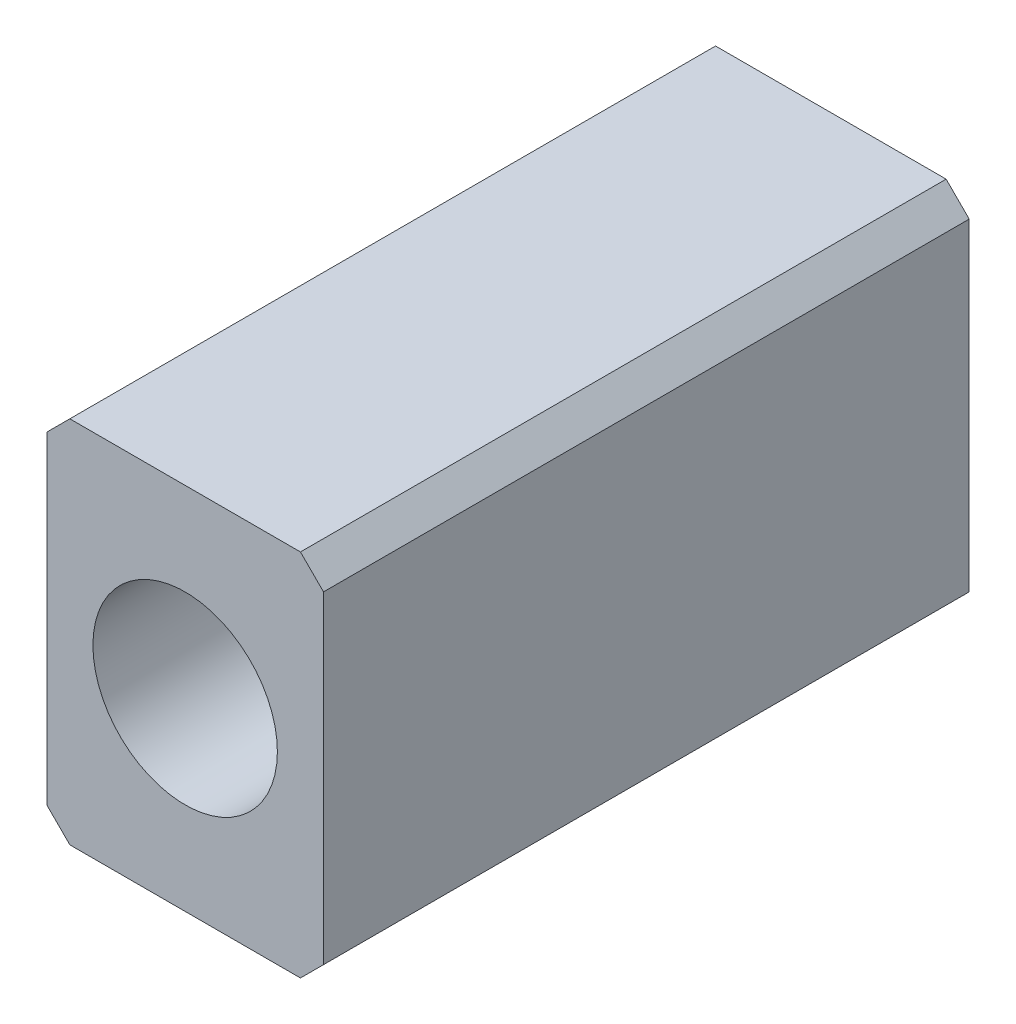
ISO-10303-21;
HEADER;
FILE_DESCRIPTION(('STEP AP214'),'2;1');
FILE_NAME('part.step','',(''),(''),'','','');
FILE_SCHEMA(('AUTOMOTIVE_DESIGN { 1 0 10303 214 1 1 1 1 }'));
ENDSEC;
DATA;
#1=APPLICATION_CONTEXT('core data for automotive mechanical design processes');
#2=APPLICATION_PROTOCOL_DEFINITION('international standard','automotive_design',2000,#1);
#3=PRODUCT_CONTEXT('',#1,'mechanical');
#4=PRODUCT('Part','Part','',(#3));
#5=PRODUCT_RELATED_PRODUCT_CATEGORY('part','',(#4));
#6=PRODUCT_DEFINITION_FORMATION('','',#4);
#7=PRODUCT_DEFINITION_CONTEXT('part definition',#1,'design');
#8=PRODUCT_DEFINITION('design','',#6,#7);
#9=PRODUCT_DEFINITION_SHAPE('','',#8);
#10=(LENGTH_UNIT() NAMED_UNIT(*) SI_UNIT(.MILLI.,.METRE.));
#11=(NAMED_UNIT(*) PLANE_ANGLE_UNIT() SI_UNIT($,.RADIAN.));
#12=(NAMED_UNIT(*) SI_UNIT($,.STERADIAN.) SOLID_ANGLE_UNIT());
#13=UNCERTAINTY_MEASURE_WITH_UNIT(LENGTH_MEASURE(1.E-05),#10,'distance_accuracy_value','');
#14=(GEOMETRIC_REPRESENTATION_CONTEXT(3) GLOBAL_UNCERTAINTY_ASSIGNED_CONTEXT((#13)) GLOBAL_UNIT_ASSIGNED_CONTEXT((#10,
#11,#12)) REPRESENTATION_CONTEXT('',''));
#15=CARTESIAN_POINT('',(0.,0.,0.));
#16=DIRECTION('',(0.,0.,1.));
#17=DIRECTION('',(1.,0.,0.));
#18=AXIS2_PLACEMENT_3D('',#15,#16,#17);
#19=CARTESIAN_POINT('',(0.,0.,14.));
#20=DIRECTION('',(0.,0.,1.));
#21=DIRECTION('',(1.,0.,0.));
#22=AXIS2_PLACEMENT_3D('',#19,#20,#21);
#23=PLANE('',#22);
#24=DIRECTION('',(0.,-1.,0.));
#25=VECTOR('',#24,1.);
#26=CARTESIAN_POINT('',(-6.,7.99999999999999,14.));
#27=LINE('',#26,#25);
#28=CARTESIAN_POINT('',(-6.,6.99999999999999,14.));
#29=VERTEX_POINT('',#28);
#30=CARTESIAN_POINT('',(-6.,-6.99999999999999,14.));
#31=VERTEX_POINT('',#30);
#32=EDGE_CURVE('E146',#29,#31,#27,.T.);
#33=ORIENTED_EDGE('',*,*,#32,.T.);
#34=DIRECTION('',(-0.707106781186546,0.707106781186549,0.));
#35=VECTOR('',#34,1.);
#36=CARTESIAN_POINT('',(-6.50000000000001,-6.49999999999998,14.));
#37=LINE('',#36,#35);
#38=CARTESIAN_POINT('',(-4.99999999999999,-8.,14.));
#39=VERTEX_POINT('',#38);
#40=EDGE_CURVE('E161',#31,#39,#37,.F.);
#41=ORIENTED_EDGE('',*,*,#40,.T.);
#42=DIRECTION('',(1.,0.,0.));
#43=VECTOR('',#42,1.);
#44=CARTESIAN_POINT('',(-6.,-8.,14.));
#45=LINE('',#44,#43);
#46=CARTESIAN_POINT('',(4.99999999999999,-7.99999999999999,14.));
#47=VERTEX_POINT('',#46);
#48=EDGE_CURVE('E128',#39,#47,#45,.T.);
#49=ORIENTED_EDGE('',*,*,#48,.T.);
#50=DIRECTION('',(-0.707106781186549,-0.707106781186546,0.));
#51=VECTOR('',#50,1.);
#52=CARTESIAN_POINT('',(6.49999999999998,-6.50000000000001,14.));
#53=LINE('',#52,#51);
#54=CARTESIAN_POINT('',(6.00000000000001,-6.99999999999999,14.));
#55=VERTEX_POINT('',#54);
#56=EDGE_CURVE('E159',#47,#55,#53,.F.);
#57=ORIENTED_EDGE('',*,*,#56,.T.);
#58=DIRECTION('',(0.,1.,0.));
#59=VECTOR('',#58,1.);
#60=CARTESIAN_POINT('',(6.,8.,14.));
#61=LINE('',#60,#59);
#62=CARTESIAN_POINT('',(6.,6.99999999999999,14.));
#63=VERTEX_POINT('',#62);
#64=EDGE_CURVE('E230',#55,#63,#61,.T.);
#65=ORIENTED_EDGE('',*,*,#64,.T.);
#66=DIRECTION('',(0.707106781186546,-0.707106781186549,0.));
#67=VECTOR('',#66,1.);
#68=CARTESIAN_POINT('',(6.50000000000001,6.49999999999998,14.));
#69=LINE('',#68,#67);
#70=CARTESIAN_POINT('',(5.,8.,14.));
#71=VERTEX_POINT('',#70);
#72=EDGE_CURVE('E63',#63,#71,#69,.F.);
#73=ORIENTED_EDGE('',*,*,#72,.T.);
#74=DIRECTION('',(-1.,0.,0.));
#75=VECTOR('',#74,1.);
#76=CARTESIAN_POINT('',(-6.,7.99999999999999,14.));
#77=LINE('',#76,#75);
#78=CARTESIAN_POINT('',(-4.99999999999999,7.99999999999999,14.));
#79=VERTEX_POINT('',#78);
#80=EDGE_CURVE('E147',#71,#79,#77,.T.);
#81=ORIENTED_EDGE('',*,*,#80,.T.);
#82=DIRECTION('',(0.707106781186549,0.707106781186546,0.));
#83=VECTOR('',#82,1.);
#84=CARTESIAN_POINT('',(-6.49999999999999,6.50000000000001,14.));
#85=LINE('',#84,#83);
#86=EDGE_CURVE('E157',#79,#29,#85,.F.);
#87=ORIENTED_EDGE('',*,*,#86,.T.);
#88=EDGE_LOOP('',(#33,#41,#49,#57,#65,#73,#81,#87));
#89=FACE_BOUND('',#88,.T.);
#90=CARTESIAN_POINT('',(0.,0.,14.));
#91=DIRECTION('',(0.,0.,1.));
#92=DIRECTION('',(1.,0.,0.));
#93=AXIS2_PLACEMENT_3D('',#90,#91,#92);
#94=CIRCLE('',#93,4.);
#95=CARTESIAN_POINT('',(4.,0.,14.));
#96=VERTEX_POINT('',#95);
#97=EDGE_CURVE('E141',#96,#96,#94,.T.);
#98=ORIENTED_EDGE('',*,*,#97,.F.);
#99=EDGE_LOOP('',(#98));
#100=FACE_BOUND('',#99,.T.);
#101=ADVANCED_FACE('F36',(#89,#100),#23,.T.);
#102=CARTESIAN_POINT('',(0.,0.,-14.));
#103=DIRECTION('',(0.,0.,1.));
#104=DIRECTION('',(1.,0.,0.));
#105=AXIS2_PLACEMENT_3D('',#102,#103,#104);
#106=PLANE('',#105);
#107=DIRECTION('',(1.,0.,0.));
#108=VECTOR('',#107,1.);
#109=CARTESIAN_POINT('',(-6.,-8.,-14.));
#110=LINE('',#109,#108);
#111=CARTESIAN_POINT('',(-4.99999999999999,-8.,-14.));
#112=VERTEX_POINT('',#111);
#113=CARTESIAN_POINT('',(5.,-7.99999999999999,-14.));
#114=VERTEX_POINT('',#113);
#115=EDGE_CURVE('E125',#112,#114,#110,.T.);
#116=ORIENTED_EDGE('',*,*,#115,.F.);
#117=DIRECTION('',(0.707106781186546,-0.707106781186549,0.));
#118=VECTOR('',#117,1.);
#119=CARTESIAN_POINT('',(-4.99999999999999,-8.,-14.));
#120=LINE('',#119,#118);
#121=CARTESIAN_POINT('',(-6.,-6.99999999999999,-14.));
#122=VERTEX_POINT('',#121);
#123=EDGE_CURVE('E108',#112,#122,#120,.F.);
#124=ORIENTED_EDGE('',*,*,#123,.T.);
#125=DIRECTION('',(0.,-1.,0.));
#126=VECTOR('',#125,1.);
#127=CARTESIAN_POINT('',(-6.,7.99999999999999,-14.));
#128=LINE('',#127,#126);
#129=CARTESIAN_POINT('',(-6.,6.99999999999999,-14.));
#130=VERTEX_POINT('',#129);
#131=EDGE_CURVE('E136',#130,#122,#128,.T.);
#132=ORIENTED_EDGE('',*,*,#131,.F.);
#133=DIRECTION('',(-0.707106781186549,-0.707106781186546,0.));
#134=VECTOR('',#133,1.);
#135=CARTESIAN_POINT('',(-6.,6.99999999999999,-14.));
#136=LINE('',#135,#134);
#137=CARTESIAN_POINT('',(-5.,7.99999999999999,-14.));
#138=VERTEX_POINT('',#137);
#139=EDGE_CURVE('E150',#130,#138,#136,.F.);
#140=ORIENTED_EDGE('',*,*,#139,.T.);
#141=DIRECTION('',(-1.,0.,0.));
#142=VECTOR('',#141,1.);
#143=CARTESIAN_POINT('',(-6.,7.99999999999999,-14.));
#144=LINE('',#143,#142);
#145=CARTESIAN_POINT('',(4.99999999999999,8.,-14.));
#146=VERTEX_POINT('',#145);
#147=EDGE_CURVE('E139',#146,#138,#144,.T.);
#148=ORIENTED_EDGE('',*,*,#147,.F.);
#149=DIRECTION('',(-0.707106781186546,0.707106781186549,0.));
#150=VECTOR('',#149,1.);
#151=CARTESIAN_POINT('',(5.,8.,-14.));
#152=LINE('',#151,#150);
#153=CARTESIAN_POINT('',(6.,6.99999999999999,-14.));
#154=VERTEX_POINT('',#153);
#155=EDGE_CURVE('E129',#146,#154,#152,.F.);
#156=ORIENTED_EDGE('',*,*,#155,.T.);
#157=DIRECTION('',(0.,1.,0.));
#158=VECTOR('',#157,1.);
#159=CARTESIAN_POINT('',(6.,8.,-14.));
#160=LINE('',#159,#158);
#161=CARTESIAN_POINT('',(6.00000000000001,-6.99999999999999,-14.));
#162=VERTEX_POINT('',#161);
#163=EDGE_CURVE('E135',#162,#154,#160,.T.);
#164=ORIENTED_EDGE('',*,*,#163,.F.);
#165=DIRECTION('',(0.707106781186549,0.707106781186546,0.));
#166=VECTOR('',#165,1.);
#167=CARTESIAN_POINT('',(6.00000000000001,-6.99999999999999,-14.));
#168=LINE('',#167,#166);
#169=EDGE_CURVE('E119',#162,#114,#168,.F.);
#170=ORIENTED_EDGE('',*,*,#169,.T.);
#171=EDGE_LOOP('',(#116,#124,#132,#140,#148,#156,#164,#170));
#172=FACE_BOUND('',#171,.T.);
#173=CARTESIAN_POINT('',(0.,0.,-14.));
#174=DIRECTION('',(0.,0.,1.));
#175=DIRECTION('',(1.,0.,0.));
#176=AXIS2_PLACEMENT_3D('',#173,#174,#175);
#177=CIRCLE('',#176,4.);
#178=CARTESIAN_POINT('',(4.,0.,-14.));
#179=VERTEX_POINT('',#178);
#180=EDGE_CURVE('E175',#179,#179,#177,.T.);
#181=ORIENTED_EDGE('',*,*,#180,.T.);
#182=EDGE_LOOP('',(#181));
#183=FACE_BOUND('',#182,.T.);
#184=ADVANCED_FACE('F132',(#172,#183),#106,.F.);
#185=CARTESIAN_POINT('',(-6.,7.99999999999999,14.));
#186=DIRECTION('',(1.,0.,0.));
#187=DIRECTION('',(0.,1.,0.));
#188=AXIS2_PLACEMENT_3D('',#185,#186,#187);
#189=PLANE('',#188);
#190=ORIENTED_EDGE('',*,*,#131,.T.);
#191=DIRECTION('',(0.,0.,1.));
#192=VECTOR('',#191,1.);
#193=CARTESIAN_POINT('',(-6.,-6.99999999999999,14.));
#194=LINE('',#193,#192);
#195=EDGE_CURVE('E113',#122,#31,#194,.T.);
#196=ORIENTED_EDGE('',*,*,#195,.T.);
#197=ORIENTED_EDGE('',*,*,#32,.F.);
#198=DIRECTION('',(0.,0.,-1.));
#199=VECTOR('',#198,1.);
#200=CARTESIAN_POINT('',(-6.,6.99999999999999,14.));
#201=LINE('',#200,#199);
#202=EDGE_CURVE('E118',#29,#130,#201,.T.);
#203=ORIENTED_EDGE('',*,*,#202,.T.);
#204=EDGE_LOOP('',(#190,#196,#197,#203));
#205=FACE_BOUND('',#204,.T.);
#206=ADVANCED_FACE('F196',(#205),#189,.F.);
#207=CARTESIAN_POINT('',(-6.,-8.,14.));
#208=DIRECTION('',(0.,1.,0.));
#209=DIRECTION('',(-1.,0.,0.));
#210=AXIS2_PLACEMENT_3D('',#207,#208,#209);
#211=PLANE('',#210);
#212=CARTESIAN_POINT('',(0.,-8.,-8.));
#213=DIRECTION('',(0.,-1.,0.));
#214=DIRECTION('',(0.,0.,-1.));
#215=AXIS2_PLACEMENT_3D('',#212,#213,#214);
#216=CIRCLE('',#215,1.24999999999999);
#217=CARTESIAN_POINT('',(0.,-8.,-9.24999999999999));
#218=VERTEX_POINT('',#217);
#219=EDGE_CURVE('E246',#218,#218,#216,.T.);
#220=ORIENTED_EDGE('',*,*,#219,.F.);
#221=EDGE_LOOP('',(#220));
#222=FACE_BOUND('',#221,.T.);
#223=CARTESIAN_POINT('',(0.,-8.,8.));
#224=DIRECTION('',(0.,-1.,0.));
#225=DIRECTION('',(0.,0.,-1.));
#226=AXIS2_PLACEMENT_3D('',#223,#224,#225);
#227=CIRCLE('',#226,1.24999999999999);
#228=CARTESIAN_POINT('',(0.,-8.,6.75000000000001));
#229=VERTEX_POINT('',#228);
#230=EDGE_CURVE('E176',#229,#229,#227,.T.);
#231=ORIENTED_EDGE('',*,*,#230,.F.);
#232=EDGE_LOOP('',(#231));
#233=FACE_BOUND('',#232,.T.);
#234=ORIENTED_EDGE('',*,*,#48,.F.);
#235=DIRECTION('',(0.,0.,-1.));
#236=VECTOR('',#235,1.);
#237=CARTESIAN_POINT('',(-4.99999999999999,-8.,14.));
#238=LINE('',#237,#236);
#239=EDGE_CURVE('E112',#39,#112,#238,.T.);
#240=ORIENTED_EDGE('',*,*,#239,.T.);
#241=ORIENTED_EDGE('',*,*,#115,.T.);
#242=DIRECTION('',(0.,0.,1.));
#243=VECTOR('',#242,1.);
#244=CARTESIAN_POINT('',(5.,-7.99999999999999,14.));
#245=LINE('',#244,#243);
#246=EDGE_CURVE('E130',#114,#47,#245,.T.);
#247=ORIENTED_EDGE('',*,*,#246,.T.);
#248=EDGE_LOOP('',(#234,#240,#241,#247));
#249=FACE_BOUND('',#248,.T.);
#250=ADVANCED_FACE('F124',(#222,#233,#249),#211,.F.);
#251=CARTESIAN_POINT('',(6.,8.,14.));
#252=DIRECTION('',(-1.,0.,0.));
#253=DIRECTION('',(0.,-1.,0.));
#254=AXIS2_PLACEMENT_3D('',#251,#252,#253);
#255=PLANE('',#254);
#256=ORIENTED_EDGE('',*,*,#64,.F.);
#257=DIRECTION('',(0.,0.,-1.));
#258=VECTOR('',#257,1.);
#259=CARTESIAN_POINT('',(6.00000000000001,-6.99999999999999,14.));
#260=LINE('',#259,#258);
#261=EDGE_CURVE('E165',#55,#162,#260,.T.);
#262=ORIENTED_EDGE('',*,*,#261,.T.);
#263=ORIENTED_EDGE('',*,*,#163,.T.);
#264=DIRECTION('',(0.,0.,1.));
#265=VECTOR('',#264,1.);
#266=CARTESIAN_POINT('',(6.,6.99999999999999,14.));
#267=LINE('',#266,#265);
#268=EDGE_CURVE('E163',#154,#63,#267,.T.);
#269=ORIENTED_EDGE('',*,*,#268,.T.);
#270=EDGE_LOOP('',(#256,#262,#263,#269));
#271=FACE_BOUND('',#270,.T.);
#272=ADVANCED_FACE('F204',(#271),#255,.F.);
#273=CARTESIAN_POINT('',(-6.,7.99999999999999,14.));
#274=DIRECTION('',(0.,-1.,0.));
#275=DIRECTION('',(1.,0.,0.));
#276=AXIS2_PLACEMENT_3D('',#273,#274,#275);
#277=PLANE('',#276);
#278=ORIENTED_EDGE('',*,*,#147,.T.);
#279=DIRECTION('',(0.,0.,1.));
#280=VECTOR('',#279,1.);
#281=CARTESIAN_POINT('',(-5.,7.99999999999999,14.));
#282=LINE('',#281,#280);
#283=EDGE_CURVE('E11',#138,#79,#282,.T.);
#284=ORIENTED_EDGE('',*,*,#283,.T.);
#285=ORIENTED_EDGE('',*,*,#80,.F.);
#286=DIRECTION('',(0.,0.,-1.));
#287=VECTOR('',#286,1.);
#288=CARTESIAN_POINT('',(5.,8.,14.));
#289=LINE('',#288,#287);
#290=EDGE_CURVE('E50',#71,#146,#289,.T.);
#291=ORIENTED_EDGE('',*,*,#290,.T.);
#292=EDGE_LOOP('',(#278,#284,#285,#291));
#293=FACE_BOUND('',#292,.T.);
#294=ADVANCED_FACE('F201',(#293),#277,.F.);
#295=CARTESIAN_POINT('',(0.,0.,14.));
#296=DIRECTION('',(0.,0.,-1.));
#297=DIRECTION('',(-1.,0.,0.));
#298=AXIS2_PLACEMENT_3D('',#295,#296,#297);
#299=CYLINDRICAL_SURFACE('',#298,4.);
#300=CARTESIAN_POINT('',(0.,-4.,-9.24999999999999));
#301=CARTESIAN_POINT('',(-0.0684391851745433,-3.99999965877989,-9.24999955341241));
#302=CARTESIAN_POINT('',(-0.136883052502855,-3.99822694984841,-9.24436077305553));
#303=CARTESIAN_POINT('',(-0.271769209588443,-3.99132894088807,-9.22201375846075));
#304=CARTESIAN_POINT('',(-0.338211042725901,-3.9862028819986,-9.20530301863563));
#305=CARTESIAN_POINT('',(-0.467128543650799,-3.97315815697909,-9.16143062880425));
#306=CARTESIAN_POINT('',(-0.529610176985796,-3.96524381499025,-9.13428515534702));
#307=CARTESIAN_POINT('',(-0.649134802346451,-3.94743969161093,-9.07038268232166));
#308=CARTESIAN_POINT('',(-0.706176935444876,-3.93754959899905,-9.0336241682194));
#309=CARTESIAN_POINT('',(-0.814965334952271,-3.91650213740283,-8.95034400798263));
#310=CARTESIAN_POINT('',(-0.866520028156649,-3.90531715926989,-8.90357911493892));
#311=CARTESIAN_POINT('',(-0.961197382036982,-3.88310046374209,-8.80213160758644));
#312=CARTESIAN_POINT('',(-1.00431847289868,-3.87206877523458,-8.74744752250545));
#313=CARTESIAN_POINT('',(-1.08194336483112,-3.85111144698173,-8.63005543619191));
#314=CARTESIAN_POINT('',(-1.11620784150128,-3.84121988301796,-8.56718252247277));
#315=CARTESIAN_POINT('',(-1.1735974107667,-3.82407801799235,-8.43620768501812));
#316=CARTESIAN_POINT('',(-1.19672543771943,-3.81682702128689,-8.36810714420606));
#317=CARTESIAN_POINT('',(-1.23048459930032,-3.80607606984501,-8.23077192254794));
#318=CARTESIAN_POINT('',(-1.24147110007863,-3.80246972929509,-8.16163315636114));
#319=CARTESIAN_POINT('',(-1.25174555036987,-3.79910055140951,-8.02240688108811));
#320=CARTESIAN_POINT('',(-1.2510366099577,-3.79933669227335,-7.95231962917834));
#321=CARTESIAN_POINT('',(-1.23821824732738,-3.80353189075438,-7.81612553973102));
#322=CARTESIAN_POINT('',(-1.22656057869381,-3.80734341745949,-7.74997087413844));
#323=CARTESIAN_POINT('',(-1.19290813355625,-3.81802025652489,-7.62060784346266));
#324=CARTESIAN_POINT('',(-1.17091225844549,-3.82488589343115,-7.5573997922912));
#325=CARTESIAN_POINT('',(-1.11688874681276,-3.84101044014297,-7.43464805556737));
#326=CARTESIAN_POINT('',(-1.0847192566208,-3.85030284660825,-7.37517138930802));
#327=CARTESIAN_POINT('',(-1.01136020737847,-3.8702185658007,-7.26231223212088));
#328=CARTESIAN_POINT('',(-0.97016830521576,-3.88084222394551,-7.20893132974629));
#329=CARTESIAN_POINT('',(-0.877716954182112,-3.90281527800493,-7.10722505658302));
#330=CARTESIAN_POINT('',(-0.826084570592806,-3.91417569605696,-7.05924044222032));
#331=CARTESIAN_POINT('',(-0.71536440809552,-3.9359157075958,-6.97252810642033));
#332=CARTESIAN_POINT('',(-0.656276077349011,-3.94629522838372,-6.9338010707808));
#333=CARTESIAN_POINT('',(-0.531664610465446,-3.96501294890191,-6.86647231139874));
#334=CARTESIAN_POINT('',(-0.466094906919271,-3.97333460648208,-6.83795186453604));
#335=CARTESIAN_POINT('',(-0.330767977782638,-3.98687955828554,-6.79244699914844));
#336=CARTESIAN_POINT('',(-0.261012030724602,-3.99210379325151,-6.77545907776162));
#337=CARTESIAN_POINT('',(-0.12218515729034,-3.99871389395014,-6.75408195742103));
#338=CARTESIAN_POINT('',(-0.0531918487888379,-4.00024022895439,-6.74923145640649));
#339=CARTESIAN_POINT('',(0.0846303057325878,-3.99969799730981,-6.75096622663734));
#340=CARTESIAN_POINT('',(0.153459174306508,-3.99762995581125,-6.75754982732262));
#341=CARTESIAN_POINT('',(0.287219332975853,-3.99022363769772,-6.78159559260641));
#342=CARTESIAN_POINT('',(0.352204978420948,-3.98496793110725,-6.79878326761253));
#343=CARTESIAN_POINT('',(0.478351928861364,-3.97180121379252,-6.8432143523667));
#344=CARTESIAN_POINT('',(0.539512760449015,-3.96388987514204,-6.87045900402492));
#345=CARTESIAN_POINT('',(0.65793240667223,-3.94598542759568,-6.93497321654881));
#346=CARTESIAN_POINT('',(0.715059739787952,-3.9359462681821,-6.97247098749723));
#347=CARTESIAN_POINT('',(0.822365850960092,-3.91493410002887,-7.05615321011703));
#348=CARTESIAN_POINT('',(0.872542738043332,-3.90396083845862,-7.10234001774312));
#349=CARTESIAN_POINT('',(0.966587462919651,-3.88176994885247,-7.2042588900537));
#350=CARTESIAN_POINT('',(1.01012652339773,-3.87055986714446,-7.26029666374527));
#351=CARTESIAN_POINT('',(1.08721250244908,-3.84961947087602,-7.37912661637075));
#352=CARTESIAN_POINT('',(1.12075957972523,-3.839889132814,-7.44191868800444));
#353=CARTESIAN_POINT('',(1.1767008348114,-3.82311782360754,-7.57234517288587));
#354=CARTESIAN_POINT('',(1.19913819558885,-3.81606646468027,-7.6399596495047));
#355=CARTESIAN_POINT('',(1.23222894320963,-3.80551170941212,-7.7782724933238));
#356=CARTESIAN_POINT('',(1.24288681414609,-3.80200696302675,-7.84896967637132));
#357=CARTESIAN_POINT('',(1.25179406157539,-3.79908292712495,-7.98800408755424));
#358=CARTESIAN_POINT('',(1.25058279621956,-3.79948604683077,-8.05630345381293));
#359=CARTESIAN_POINT('',(1.23708818129473,-3.80390090472383,-8.19167458491918));
#360=CARTESIAN_POINT('',(1.22480534822558,-3.80791247457319,-8.258746406884));
#361=CARTESIAN_POINT('',(1.18987729913377,-3.81896814158112,-8.38879403960178));
#362=CARTESIAN_POINT('',(1.16738642405943,-3.82596698183475,-8.45181544109601));
#363=CARTESIAN_POINT('',(1.11280227335063,-3.84219704261348,-8.57324041353135));
#364=CARTESIAN_POINT('',(1.08070704444253,-3.85142871716522,-8.63164304207768));
#365=CARTESIAN_POINT('',(1.00635675013474,-3.8715348703158,-8.74464597044056));
#366=CARTESIAN_POINT('',(0.963753335241266,-3.88245948922441,-8.79900812950044));
#367=CARTESIAN_POINT('',(0.870208996404841,-3.90448998821726,-8.89998632811179));
#368=CARTESIAN_POINT('',(0.819265842344396,-3.91559591606795,-8.946600288991));
#369=CARTESIAN_POINT('',(0.708486662823326,-3.93717271952329,-9.03228253836298));
#370=CARTESIAN_POINT('',(0.648414574487374,-3.94761101730634,-9.07105473644996));
#371=CARTESIAN_POINT('',(0.522279138013649,-3.96626769296917,-9.13789891513943));
#372=CARTESIAN_POINT('',(0.456218157795445,-3.97448694315832,-9.16597510214182));
#373=CARTESIAN_POINT('',(0.325747635373975,-3.98720650733461,-9.20859136760846));
#374=CARTESIAN_POINT('',(0.261670337112545,-3.99196240806139,-9.22407486730533));
#375=CARTESIAN_POINT('',(0.131729895440249,-3.99835900340486,-9.2447783599677));
#376=CARTESIAN_POINT('',(0.0658671161396766,-4.00000032839644,-9.25000042980399));
#377=CARTESIAN_POINT('',(0.,-4.,-9.24999999999999));
#378=B_SPLINE_CURVE_WITH_KNOTS('',3,(#300,#301,#302,#303,#304,#305,#306,#307,#308,#309,#310,
#311,#312,#313,#314,#315,#316,#317,#318,#319,#320,#321,#322,#323,#324,#325,#326,#327,#328,#329,
#330,#331,#332,#333,#334,#335,#336,#337,#338,#339,#340,#341,#342,#343,#344,#345,#346,#347,#348,
#349,#350,#351,#352,#353,#354,#355,#356,#357,#358,#359,#360,#361,#362,#363,#364,#365,#366,#367,
#368,#369,#370,#371,#372,#373,#374,#375,#376,#377),.UNSPECIFIED.,.T.,.F.,(4,2,2,2,2,2,2,2,2,2,2,
2,2,2,2,2,2,2,2,2,2,2,2,2,2,2,2,2,2,2,2,2,2,2,2,2,2,2,4),(0.,0.205075449432508,
0.410197323349063,0.61500247920243,0.819839921558384,1.03037822195157,1.24095567431275,
1.45673771247493,1.67246286279526,1.88169150167208,2.09086450295136,2.29176917422167,
2.49269519979061,2.69655642720543,2.90047066010356,3.11366747279597,3.326880074133,
3.54175460689767,3.7565638449455,3.96307568548234,4.16955735649359,4.37090626722868,
4.57228005034495,4.77856324738339,4.98490245709255,5.19941778713135,5.41392970983707,
5.62760115751026,5.84119123892425,6.04512203476048,6.24904331751079,6.44997913396665,
6.65095584330168,6.85979514006355,7.06869037373334,7.28440668126406,7.5000380666633,
7.69744636651534,7.8948147076304),.UNSPECIFIED.);
#379=CARTESIAN_POINT('',(0.,-4.,-9.24999999999999));
#380=VERTEX_POINT('',#379);
#381=EDGE_CURVE('E40',#380,#380,#378,.T.);
#382=ORIENTED_EDGE('',*,*,#381,.F.);
#383=EDGE_LOOP('',(#382));
#384=FACE_BOUND('',#383,.T.);
#385=CARTESIAN_POINT('',(0.,-4.,6.75000000000001));
#386=CARTESIAN_POINT('',(-0.0684391851745431,-3.99999965877989,6.75000044658759));
#387=CARTESIAN_POINT('',(-0.136883052502855,-3.99822694984841,6.75563922694447));
#388=CARTESIAN_POINT('',(-0.271769209588443,-3.99132894088807,6.77798624153925));
#389=CARTESIAN_POINT('',(-0.338211042725901,-3.9862028819986,6.79469698136437));
#390=CARTESIAN_POINT('',(-0.467128543650799,-3.97315815697909,6.83856937119575));
#391=CARTESIAN_POINT('',(-0.529610176985796,-3.96524381499025,6.86571484465298));
#392=CARTESIAN_POINT('',(-0.649134802346451,-3.94743969161093,6.92961731767834));
#393=CARTESIAN_POINT('',(-0.706176935444875,-3.93754959899905,6.9663758317806));
#394=CARTESIAN_POINT('',(-0.814965334952271,-3.91650213740283,7.04965599201737));
#395=CARTESIAN_POINT('',(-0.866520028156649,-3.90531715926989,7.09642088506108));
#396=CARTESIAN_POINT('',(-0.961197382036982,-3.88310046374209,7.19786839241356));
#397=CARTESIAN_POINT('',(-1.00431847289868,-3.87206877523458,7.25255247749455));
#398=CARTESIAN_POINT('',(-1.08194336483112,-3.85111144698173,7.36994456380809));
#399=CARTESIAN_POINT('',(-1.11620784150127,-3.84121988301796,7.43281747752723));
#400=CARTESIAN_POINT('',(-1.1735974107667,-3.82407801799235,7.56379231498188));
#401=CARTESIAN_POINT('',(-1.19672543771943,-3.81682702128689,7.63189285579393));
#402=CARTESIAN_POINT('',(-1.23048459930032,-3.80607606984501,7.76922807745206));
#403=CARTESIAN_POINT('',(-1.24147110007863,-3.80246972929509,7.83836684363885));
#404=CARTESIAN_POINT('',(-1.25174555036987,-3.79910055140951,7.97759311891189));
#405=CARTESIAN_POINT('',(-1.2510366099577,-3.79933669227335,8.04768037082166));
#406=CARTESIAN_POINT('',(-1.23821824732738,-3.80353189075438,8.18387446026898));
#407=CARTESIAN_POINT('',(-1.22656057869381,-3.80734341745949,8.25002912586156));
#408=CARTESIAN_POINT('',(-1.19290813355625,-3.81802025652489,8.37939215653734));
#409=CARTESIAN_POINT('',(-1.17091225844549,-3.82488589343115,8.4426002077088));
#410=CARTESIAN_POINT('',(-1.11688874681276,-3.84101044014297,8.56535194443263));
#411=CARTESIAN_POINT('',(-1.08471925662081,-3.85030284660825,8.62482861069198));
#412=CARTESIAN_POINT('',(-1.01136020737847,-3.8702185658007,8.73768776787912));
#413=CARTESIAN_POINT('',(-0.970168305215761,-3.88084222394551,8.79106867025371));
#414=CARTESIAN_POINT('',(-0.877716954182113,-3.90281527800493,8.89277494341698));
#415=CARTESIAN_POINT('',(-0.826084570592807,-3.91417569605696,8.94075955777967));
#416=CARTESIAN_POINT('',(-0.715364408095521,-3.9359157075958,9.02747189357967));
#417=CARTESIAN_POINT('',(-0.656276077349012,-3.94629522838372,9.0661989292192));
#418=CARTESIAN_POINT('',(-0.531664610465447,-3.96501294890191,9.13352768860127));
#419=CARTESIAN_POINT('',(-0.466094906919272,-3.97333460648208,9.16204813546396));
#420=CARTESIAN_POINT('',(-0.330767977782638,-3.98687955828554,9.20755300085156));
#421=CARTESIAN_POINT('',(-0.261012030724602,-3.99210379325151,9.22454092223838));
#422=CARTESIAN_POINT('',(-0.122185157290339,-3.99871389395014,9.24591804257897));
#423=CARTESIAN_POINT('',(-0.0531918487888372,-4.00024022895439,9.25076854359351));
#424=CARTESIAN_POINT('',(0.0846303057325882,-3.99969799730981,9.24903377336266));
#425=CARTESIAN_POINT('',(0.153459174306508,-3.99762995581125,9.24245017267738));
#426=CARTESIAN_POINT('',(0.287219332975853,-3.99022363769772,9.21840440739359));
#427=CARTESIAN_POINT('',(0.352204978420948,-3.98496793110725,9.20121673238747));
#428=CARTESIAN_POINT('',(0.478351928861365,-3.97180121379252,9.1567856476333));
#429=CARTESIAN_POINT('',(0.539512760449014,-3.96388987514204,9.12954099597508));
#430=CARTESIAN_POINT('',(0.657932406672229,-3.94598542759568,9.0650267834512));
#431=CARTESIAN_POINT('',(0.715059739787953,-3.9359462681821,9.02752901250277));
#432=CARTESIAN_POINT('',(0.822365850960092,-3.91493410002887,8.94384678988298));
#433=CARTESIAN_POINT('',(0.872542738043331,-3.90396083845862,8.89765998225688));
#434=CARTESIAN_POINT('',(0.966587462919651,-3.88176994885248,8.7957411099463));
#435=CARTESIAN_POINT('',(1.01012652339773,-3.87055986714446,8.73970333625473));
#436=CARTESIAN_POINT('',(1.08721250244908,-3.84961947087602,8.62087338362925));
#437=CARTESIAN_POINT('',(1.12075957972523,-3.839889132814,8.55808131199556));
#438=CARTESIAN_POINT('',(1.1767008348114,-3.82311782360754,8.42765482711414));
#439=CARTESIAN_POINT('',(1.19913819558885,-3.81606646468027,8.3600403504953));
#440=CARTESIAN_POINT('',(1.23222894320963,-3.80551170941212,8.2217275066762));
#441=CARTESIAN_POINT('',(1.24288681414609,-3.80200696302675,8.15103032362868));
#442=CARTESIAN_POINT('',(1.25179406157539,-3.79908292712495,8.01199591244576));
#443=CARTESIAN_POINT('',(1.25058279621956,-3.79948604683077,7.94369654618707));
#444=CARTESIAN_POINT('',(1.23708818129473,-3.80390090472383,7.80832541508082));
#445=CARTESIAN_POINT('',(1.22480534822558,-3.80791247457319,7.741253593116));
#446=CARTESIAN_POINT('',(1.18987729913377,-3.81896814158112,7.61120596039822));
#447=CARTESIAN_POINT('',(1.16738642405943,-3.82596698183475,7.54818455890399));
#448=CARTESIAN_POINT('',(1.11280227335063,-3.84219704261348,7.42675958646865));
#449=CARTESIAN_POINT('',(1.08070704444253,-3.85142871716522,7.36835695792232));
#450=CARTESIAN_POINT('',(1.00635675013474,-3.8715348703158,7.25535402955944));
#451=CARTESIAN_POINT('',(0.963753335241265,-3.88245948922441,7.20099187049956));
#452=CARTESIAN_POINT('',(0.87020899640484,-3.90448998821726,7.10001367188821));
#453=CARTESIAN_POINT('',(0.819265842344395,-3.91559591606795,7.053399711009));
#454=CARTESIAN_POINT('',(0.708486662823326,-3.93717271952329,6.96771746163702));
#455=CARTESIAN_POINT('',(0.648414574487374,-3.94761101730634,6.92894526355004));
#456=CARTESIAN_POINT('',(0.522279138013648,-3.96626769296917,6.86210108486057));
#457=CARTESIAN_POINT('',(0.456218157795445,-3.97448694315832,6.83402489785818));
#458=CARTESIAN_POINT('',(0.325747635373975,-3.98720650733461,6.79140863239154));
#459=CARTESIAN_POINT('',(0.261670337112544,-3.99196240806139,6.77592513269467));
#460=CARTESIAN_POINT('',(0.131729895440248,-3.99835900340486,6.7552216400323));
#461=CARTESIAN_POINT('',(0.0658671161396763,-4.00000032839644,6.74999957019601));
#462=CARTESIAN_POINT('',(0.,-4.,6.75000000000001));
#463=B_SPLINE_CURVE_WITH_KNOTS('',3,(#385,#386,#387,#388,#389,#390,#391,#392,#393,#394,#395,
#396,#397,#398,#399,#400,#401,#402,#403,#404,#405,#406,#407,#408,#409,#410,#411,#412,#413,#414,
#415,#416,#417,#418,#419,#420,#421,#422,#423,#424,#425,#426,#427,#428,#429,#430,#431,#432,#433,
#434,#435,#436,#437,#438,#439,#440,#441,#442,#443,#444,#445,#446,#447,#448,#449,#450,#451,#452,
#453,#454,#455,#456,#457,#458,#459,#460,#461,#462),.UNSPECIFIED.,.T.,.F.,(4,2,2,2,2,2,2,2,2,2,2,
2,2,2,2,2,2,2,2,2,2,2,2,2,2,2,2,2,2,2,2,2,2,2,2,2,2,2,4),(0.,0.205075449432508,
0.410197323349063,0.61500247920243,0.819839921558383,1.03037822195157,1.24095567431275,
1.45673771247493,1.67246286279525,1.88169150167208,2.09086450295136,2.29176917422167,
2.49269519979061,2.69655642720543,2.90047066010356,3.11366747279597,3.326880074133,
3.54175460689767,3.7565638449455,3.96307568548234,4.16955735649359,4.37090626722868,
4.57228005034495,4.77856324738339,4.98490245709255,5.19941778713135,5.41392970983707,
5.62760115751026,5.84119123892425,6.04512203476048,6.24904331751079,6.44997913396665,
6.65095584330168,6.85979514006356,7.06869037373334,7.28440668126406,7.50003806666331,
7.69744636651534,7.8948147076304),.UNSPECIFIED.);
#464=CARTESIAN_POINT('',(0.,-4.,6.75000000000001));
#465=VERTEX_POINT('',#464);
#466=EDGE_CURVE('E169',#465,#465,#463,.T.);
#467=ORIENTED_EDGE('',*,*,#466,.F.);
#468=EDGE_LOOP('',(#467));
#469=FACE_BOUND('',#468,.T.);
#470=ORIENTED_EDGE('',*,*,#97,.T.);
#471=EDGE_LOOP('',(#470));
#472=FACE_BOUND('',#471,.T.);
#473=ORIENTED_EDGE('',*,*,#180,.F.);
#474=EDGE_LOOP('',(#473));
#475=FACE_BOUND('',#474,.T.);
#476=ADVANCED_FACE('F177',(#384,#469,#472,#475),#299,.F.);
#477=CARTESIAN_POINT('',(-4.99999999999999,-8.,14.));
#478=DIRECTION('',(0.707106781186549,0.707106781186546,0.));
#479=DIRECTION('',(0.,0.,-1.));
#480=AXIS2_PLACEMENT_3D('',#477,#478,#479);
#481=PLANE('',#480);
#482=ORIENTED_EDGE('',*,*,#40,.F.);
#483=ORIENTED_EDGE('',*,*,#195,.F.);
#484=ORIENTED_EDGE('',*,*,#123,.F.);
#485=ORIENTED_EDGE('',*,*,#239,.F.);
#486=EDGE_LOOP('',(#482,#483,#484,#485));
#487=FACE_BOUND('',#486,.T.);
#488=ADVANCED_FACE('F111',(#487),#481,.F.);
#489=CARTESIAN_POINT('',(6.00000000000001,-6.99999999999999,14.));
#490=DIRECTION('',(-0.707106781186546,0.707106781186549,0.));
#491=DIRECTION('',(0.,0.,-1.));
#492=AXIS2_PLACEMENT_3D('',#489,#490,#491);
#493=PLANE('',#492);
#494=ORIENTED_EDGE('',*,*,#56,.F.);
#495=ORIENTED_EDGE('',*,*,#246,.F.);
#496=ORIENTED_EDGE('',*,*,#169,.F.);
#497=ORIENTED_EDGE('',*,*,#261,.F.);
#498=EDGE_LOOP('',(#494,#495,#496,#497));
#499=FACE_BOUND('',#498,.T.);
#500=ADVANCED_FACE('F216',(#499),#493,.F.);
#501=CARTESIAN_POINT('',(-6.,6.99999999999999,14.));
#502=DIRECTION('',(0.707106781186546,-0.707106781186549,0.));
#503=DIRECTION('',(0.,0.,-1.));
#504=AXIS2_PLACEMENT_3D('',#501,#502,#503);
#505=PLANE('',#504);
#506=ORIENTED_EDGE('',*,*,#86,.F.);
#507=ORIENTED_EDGE('',*,*,#283,.F.);
#508=ORIENTED_EDGE('',*,*,#139,.F.);
#509=ORIENTED_EDGE('',*,*,#202,.F.);
#510=EDGE_LOOP('',(#506,#507,#508,#509));
#511=FACE_BOUND('',#510,.T.);
#512=ADVANCED_FACE('F218',(#511),#505,.F.);
#513=CARTESIAN_POINT('',(5.,8.,14.));
#514=DIRECTION('',(-0.707106781186549,-0.707106781186546,0.));
#515=DIRECTION('',(0.,0.,-1.));
#516=AXIS2_PLACEMENT_3D('',#513,#514,#515);
#517=PLANE('',#516);
#518=ORIENTED_EDGE('',*,*,#72,.F.);
#519=ORIENTED_EDGE('',*,*,#268,.F.);
#520=ORIENTED_EDGE('',*,*,#155,.F.);
#521=ORIENTED_EDGE('',*,*,#290,.F.);
#522=EDGE_LOOP('',(#518,#519,#520,#521));
#523=FACE_BOUND('',#522,.T.);
#524=ADVANCED_FACE('F38',(#523),#517,.F.);
#525=CARTESIAN_POINT('',(0.,-8.,8.));
#526=DIRECTION('',(0.,-1.,0.));
#527=DIRECTION('',(0.,0.,-1.));
#528=AXIS2_PLACEMENT_3D('',#525,#526,#527);
#529=CYLINDRICAL_SURFACE('',#528,1.24999999999999);
#530=ORIENTED_EDGE('',*,*,#466,.T.);
#531=EDGE_LOOP('',(#530));
#532=FACE_BOUND('',#531,.T.);
#533=ORIENTED_EDGE('',*,*,#230,.T.);
#534=EDGE_LOOP('',(#533));
#535=FACE_BOUND('',#534,.T.);
#536=ADVANCED_FACE('F180',(#532,#535),#529,.F.);
#537=CARTESIAN_POINT('',(0.,-8.,-8.));
#538=DIRECTION('',(0.,-1.,0.));
#539=DIRECTION('',(0.,0.,-1.));
#540=AXIS2_PLACEMENT_3D('',#537,#538,#539);
#541=CYLINDRICAL_SURFACE('',#540,1.24999999999999);
#542=ORIENTED_EDGE('',*,*,#381,.T.);
#543=EDGE_LOOP('',(#542));
#544=FACE_BOUND('',#543,.T.);
#545=ORIENTED_EDGE('',*,*,#219,.T.);
#546=EDGE_LOOP('',(#545));
#547=FACE_BOUND('',#546,.T.);
#548=ADVANCED_FACE('F183',(#544,#547),#541,.F.);
#549=CLOSED_SHELL('',(#101,#184,#206,#250,#272,#294,#476,#488,#500,#512,#524,#536,#548));
#550=MANIFOLD_SOLID_BREP('B2',#549);
#551=ADVANCED_BREP_SHAPE_REPRESENTATION('',(#18,#550),#14);
#552=SHAPE_DEFINITION_REPRESENTATION(#9,#551);
ENDSEC;
END-ISO-10303-21;
